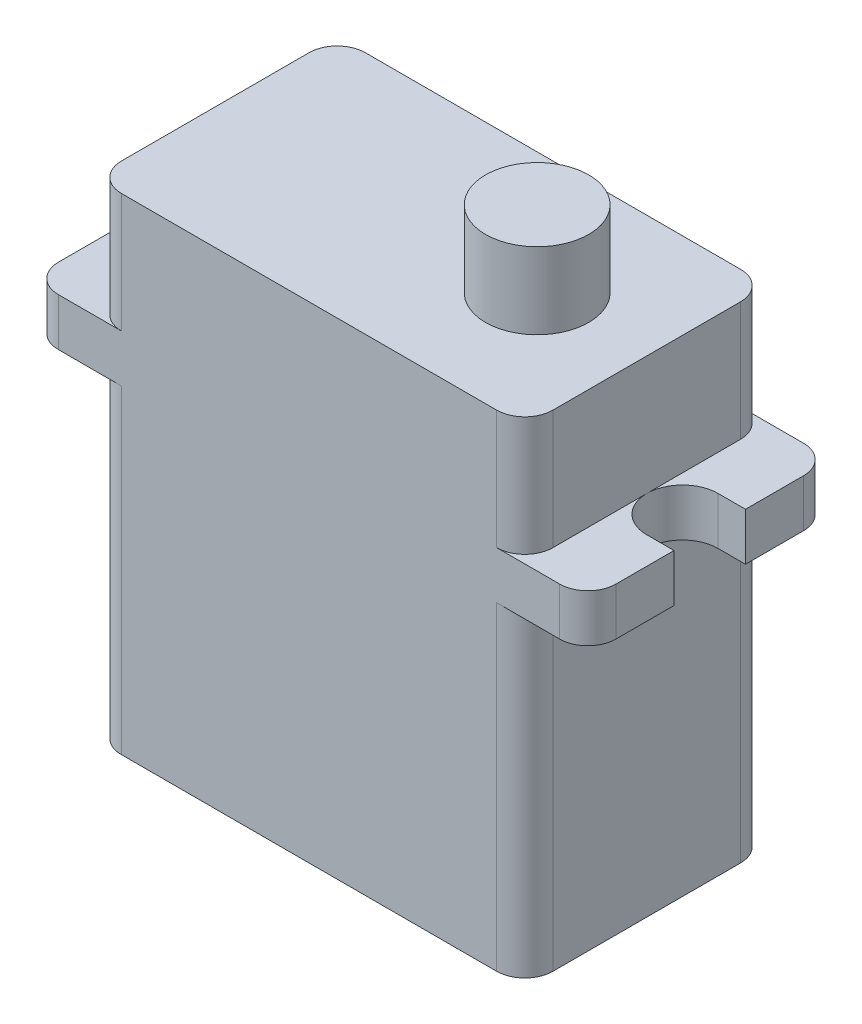
ISO-10303-21;
HEADER;
FILE_DESCRIPTION(('STEP AP214'),'2;1');
FILE_NAME('part.step','',(''),(''),'','','');
FILE_SCHEMA(('AUTOMOTIVE_DESIGN { 1 0 10303 214 1 1 1 1 }'));
ENDSEC;
DATA;
#1=APPLICATION_CONTEXT('core data for automotive mechanical design processes');
#2=APPLICATION_PROTOCOL_DEFINITION('international standard','automotive_design',2000,#1);
#3=PRODUCT_CONTEXT('',#1,'mechanical');
#4=PRODUCT('Part','Part','',(#3));
#5=PRODUCT_RELATED_PRODUCT_CATEGORY('part','',(#4));
#6=PRODUCT_DEFINITION_FORMATION('','',#4);
#7=PRODUCT_DEFINITION_CONTEXT('part definition',#1,'design');
#8=PRODUCT_DEFINITION('design','',#6,#7);
#9=PRODUCT_DEFINITION_SHAPE('','',#8);
#10=(LENGTH_UNIT() NAMED_UNIT(*) SI_UNIT(.MILLI.,.METRE.));
#11=(NAMED_UNIT(*) PLANE_ANGLE_UNIT() SI_UNIT($,.RADIAN.));
#12=(NAMED_UNIT(*) SI_UNIT($,.STERADIAN.) SOLID_ANGLE_UNIT());
#13=UNCERTAINTY_MEASURE_WITH_UNIT(LENGTH_MEASURE(1.E-05),#10,'distance_accuracy_value','');
#14=(GEOMETRIC_REPRESENTATION_CONTEXT(3) GLOBAL_UNCERTAINTY_ASSIGNED_CONTEXT((#13)) GLOBAL_UNIT_ASSIGNED_CONTEXT((#10,
#11,#12)) REPRESENTATION_CONTEXT('',''));
#15=CARTESIAN_POINT('',(0.,0.,0.));
#16=DIRECTION('',(0.,0.,1.));
#17=DIRECTION('',(1.,0.,0.));
#18=AXIS2_PLACEMENT_3D('',#15,#16,#17);
#19=CARTESIAN_POINT('',(0.,19.558,0.));
#20=DIRECTION('',(0.,1.,0.));
#21=DIRECTION('',(0.,0.,1.));
#22=AXIS2_PLACEMENT_3D('',#19,#20,#21);
#23=PLANE('',#22);
#24=CARTESIAN_POINT('',(-1.905,19.558,6.5));
#25=DIRECTION('',(0.,1.,0.));
#26=DIRECTION('',(0.,0.,1.));
#27=AXIS2_PLACEMENT_3D('',#24,#25,#26);
#28=CIRCLE('',#27,1.905);
#29=CARTESIAN_POINT('',(0.,19.558,6.5));
#30=VERTEX_POINT('',#29);
#31=CARTESIAN_POINT('',(-1.905,19.558,4.595));
#32=VERTEX_POINT('',#31);
#33=EDGE_CURVE('E376',#30,#32,#28,.T.);
#34=ORIENTED_EDGE('',*,*,#33,.F.);
#35=DIRECTION('',(0.,0.,-1.));
#36=VECTOR('',#35,1.);
#37=CARTESIAN_POINT('',(0.,19.558,11.5));
#38=LINE('',#37,#36);
#39=CARTESIAN_POINT('',(0.,19.558,1.50000000000001));
#40=VERTEX_POINT('',#39);
#41=EDGE_CURVE('E11',#30,#40,#38,.T.);
#42=ORIENTED_EDGE('',*,*,#41,.T.);
#43=CARTESIAN_POINT('',(1.5,19.558,1.5));
#44=DIRECTION('',(0.,-1.,0.));
#45=DIRECTION('',(0.,0.,-1.));
#46=AXIS2_PLACEMENT_3D('',#43,#44,#45);
#47=CIRCLE('',#46,1.5);
#48=CARTESIAN_POINT('',(1.5,19.558,0.));
#49=VERTEX_POINT('',#48);
#50=EDGE_CURVE('E334',#40,#49,#47,.T.);
#51=ORIENTED_EDGE('',*,*,#50,.T.);
#52=DIRECTION('',(-1.,0.,0.));
#53=VECTOR('',#52,1.);
#54=CARTESIAN_POINT('',(0.,19.558,0.));
#55=LINE('',#54,#53);
#56=CARTESIAN_POINT('',(-1.859,19.558,0.));
#57=VERTEX_POINT('',#56);
#58=EDGE_CURVE('E365',#49,#57,#55,.T.);
#59=ORIENTED_EDGE('',*,*,#58,.T.);
#60=CARTESIAN_POINT('',(-1.859,19.558,1.5));
#61=DIRECTION('',(0.,1.,0.));
#62=DIRECTION('',(0.,0.,1.));
#63=AXIS2_PLACEMENT_3D('',#60,#61,#62);
#64=CIRCLE('',#63,1.5);
#65=CARTESIAN_POINT('',(-3.359,19.558,1.5));
#66=VERTEX_POINT('',#65);
#67=EDGE_CURVE('E364',#66,#57,#64,.F.);
#68=ORIENTED_EDGE('',*,*,#67,.F.);
#69=DIRECTION('',(0.,0.,1.));
#70=VECTOR('',#69,1.);
#71=CARTESIAN_POINT('',(-3.359,19.558,0.));
#72=LINE('',#71,#70);
#73=CARTESIAN_POINT('',(-3.359,19.558,4.595));
#74=VERTEX_POINT('',#73);
#75=EDGE_CURVE('E369',#66,#74,#72,.T.);
#76=ORIENTED_EDGE('',*,*,#75,.T.);
#77=DIRECTION('',(-1.,0.,0.));
#78=VECTOR('',#77,1.);
#79=CARTESIAN_POINT('',(0.,19.558,4.595));
#80=LINE('',#79,#78);
#81=EDGE_CURVE('E372',#32,#74,#80,.T.);
#82=ORIENTED_EDGE('',*,*,#81,.F.);
#83=EDGE_LOOP('',(#34,#42,#51,#59,#68,#76,#82));
#84=FACE_BOUND('',#83,.T.);
#85=ADVANCED_FACE('F47',(#84),#23,.T.);
#86=CARTESIAN_POINT('',(24.859,19.558,0.));
#87=VERTEX_POINT('',#86);
#88=CARTESIAN_POINT('',(21.5,19.558,0.));
#89=VERTEX_POINT('',#88);
#90=EDGE_CURVE('E361',#87,#89,#55,.T.);
#91=ORIENTED_EDGE('',*,*,#90,.T.);
#92=CARTESIAN_POINT('',(21.5,19.558,1.5));
#93=DIRECTION('',(0.,-1.,0.));
#94=DIRECTION('',(0.,0.,-1.));
#95=AXIS2_PLACEMENT_3D('',#92,#93,#94);
#96=CIRCLE('',#95,1.5);
#97=CARTESIAN_POINT('',(23.,19.558,1.50000000000001));
#98=VERTEX_POINT('',#97);
#99=EDGE_CURVE('E331',#89,#98,#96,.T.);
#100=ORIENTED_EDGE('',*,*,#99,.T.);
#101=DIRECTION('',(0.,0.,1.));
#102=VECTOR('',#101,1.);
#103=CARTESIAN_POINT('',(23.,19.558,1.50000000000001));
#104=LINE('',#103,#102);
#105=CARTESIAN_POINT('',(23.,19.558,6.5));
#106=VERTEX_POINT('',#105);
#107=EDGE_CURVE('E328',#98,#106,#104,.T.);
#108=ORIENTED_EDGE('',*,*,#107,.T.);
#109=CARTESIAN_POINT('',(24.905,19.558,6.5));
#110=DIRECTION('',(0.,1.,0.));
#111=DIRECTION('',(0.,0.,1.));
#112=AXIS2_PLACEMENT_3D('',#109,#110,#111);
#113=CIRCLE('',#112,1.905);
#114=CARTESIAN_POINT('',(24.905,19.558,4.595));
#115=VERTEX_POINT('',#114);
#116=EDGE_CURVE('E407',#115,#106,#113,.T.);
#117=ORIENTED_EDGE('',*,*,#116,.F.);
#118=DIRECTION('',(1.,0.,0.));
#119=VECTOR('',#118,1.);
#120=CARTESIAN_POINT('',(0.,19.558,4.595));
#121=LINE('',#120,#119);
#122=CARTESIAN_POINT('',(26.359,19.558,4.595));
#123=VERTEX_POINT('',#122);
#124=EDGE_CURVE('E411',#115,#123,#121,.T.);
#125=ORIENTED_EDGE('',*,*,#124,.T.);
#126=DIRECTION('',(0.,0.,1.));
#127=VECTOR('',#126,1.);
#128=CARTESIAN_POINT('',(26.359,19.558,0.));
#129=LINE('',#128,#127);
#130=CARTESIAN_POINT('',(26.359,19.558,1.5));
#131=VERTEX_POINT('',#130);
#132=EDGE_CURVE('E414',#131,#123,#129,.T.);
#133=ORIENTED_EDGE('',*,*,#132,.F.);
#134=CARTESIAN_POINT('',(24.859,19.558,1.5));
#135=DIRECTION('',(0.,1.,0.));
#136=DIRECTION('',(0.,0.,1.));
#137=AXIS2_PLACEMENT_3D('',#134,#135,#136);
#138=CIRCLE('',#137,1.5);
#139=EDGE_CURVE('E418',#131,#87,#138,.T.);
#140=ORIENTED_EDGE('',*,*,#139,.T.);
#141=EDGE_LOOP('',(#91,#100,#108,#117,#125,#133,#140));
#142=FACE_BOUND('',#141,.T.);
#143=ADVANCED_FACE('F686',(#142),#23,.T.);
#144=CARTESIAN_POINT('',(24.905,19.558,8.405));
#145=VERTEX_POINT('',#144);
#146=EDGE_CURVE('E406',#106,#145,#113,.T.);
#147=ORIENTED_EDGE('',*,*,#146,.F.);
#148=CARTESIAN_POINT('',(23.,19.558,11.5));
#149=VERTEX_POINT('',#148);
#150=EDGE_CURVE('E57',#106,#149,#104,.T.);
#151=ORIENTED_EDGE('',*,*,#150,.T.);
#152=CARTESIAN_POINT('',(21.5,19.558,11.5));
#153=DIRECTION('',(0.,1.,0.));
#154=DIRECTION('',(0.,0.,1.));
#155=AXIS2_PLACEMENT_3D('',#152,#153,#154);
#156=CIRCLE('',#155,1.5);
#157=CARTESIAN_POINT('',(21.5,19.558,13.));
#158=VERTEX_POINT('',#157);
#159=EDGE_CURVE('E324',#158,#149,#156,.T.);
#160=ORIENTED_EDGE('',*,*,#159,.F.);
#161=DIRECTION('',(1.,0.,0.));
#162=VECTOR('',#161,1.);
#163=CARTESIAN_POINT('',(0.,19.558,13.));
#164=LINE('',#163,#162);
#165=CARTESIAN_POINT('',(24.859,19.558,13.));
#166=VERTEX_POINT('',#165);
#167=EDGE_CURVE('E391',#158,#166,#164,.T.);
#168=ORIENTED_EDGE('',*,*,#167,.T.);
#169=CARTESIAN_POINT('',(24.859,19.558,11.5));
#170=DIRECTION('',(0.,1.,0.));
#171=DIRECTION('',(0.,0.,1.));
#172=AXIS2_PLACEMENT_3D('',#169,#170,#171);
#173=CIRCLE('',#172,1.5);
#174=CARTESIAN_POINT('',(26.359,19.558,11.5));
#175=VERTEX_POINT('',#174);
#176=EDGE_CURVE('E395',#166,#175,#173,.T.);
#177=ORIENTED_EDGE('',*,*,#176,.T.);
#178=DIRECTION('',(0.,0.,1.));
#179=VECTOR('',#178,1.);
#180=CARTESIAN_POINT('',(26.359,19.558,0.));
#181=LINE('',#180,#179);
#182=CARTESIAN_POINT('',(26.359,19.558,8.405));
#183=VERTEX_POINT('',#182);
#184=EDGE_CURVE('E398',#183,#175,#181,.T.);
#185=ORIENTED_EDGE('',*,*,#184,.F.);
#186=DIRECTION('',(1.,0.,0.));
#187=VECTOR('',#186,1.);
#188=CARTESIAN_POINT('',(0.,19.558,8.405));
#189=LINE('',#188,#187);
#190=EDGE_CURVE('E402',#145,#183,#189,.T.);
#191=ORIENTED_EDGE('',*,*,#190,.F.);
#192=EDGE_LOOP('',(#147,#151,#160,#168,#177,#185,#191));
#193=FACE_BOUND('',#192,.T.);
#194=ADVANCED_FACE('F692',(#193),#23,.T.);
#195=CARTESIAN_POINT('',(1.5,17.018,1.5));
#196=DIRECTION('',(0.,-1.,0.));
#197=DIRECTION('',(0.,0.,-1.));
#198=AXIS2_PLACEMENT_3D('',#195,#196,#197);
#199=CYLINDRICAL_SURFACE('',#198,1.5);
#200=CARTESIAN_POINT('',(1.5,0.,1.5));
#201=DIRECTION('',(0.,-1.,0.));
#202=DIRECTION('',(0.,0.,-1.));
#203=AXIS2_PLACEMENT_3D('',#200,#201,#202);
#204=CIRCLE('',#203,1.5);
#205=CARTESIAN_POINT('',(0.,0.,1.50000000000001));
#206=VERTEX_POINT('',#205);
#207=CARTESIAN_POINT('',(1.50000000000001,0.,0.));
#208=VERTEX_POINT('',#207);
#209=EDGE_CURVE('E540',#206,#208,#204,.T.);
#210=ORIENTED_EDGE('',*,*,#209,.F.);
#211=DIRECTION('',(0.,-1.,0.));
#212=VECTOR('',#211,1.);
#213=CARTESIAN_POINT('',(0.,17.018,1.50000000000001));
#214=LINE('',#213,#212);
#215=CARTESIAN_POINT('',(0.,17.018,1.50000000000001));
#216=VERTEX_POINT('',#215);
#217=EDGE_CURVE('E597',#216,#206,#214,.T.);
#218=ORIENTED_EDGE('',*,*,#217,.F.);
#219=CARTESIAN_POINT('',(1.5,17.018,1.5));
#220=DIRECTION('',(0.,-1.,0.));
#221=DIRECTION('',(0.,0.,-1.));
#222=AXIS2_PLACEMENT_3D('',#219,#220,#221);
#223=CIRCLE('',#222,1.5);
#224=CARTESIAN_POINT('',(1.50000000000001,17.018,0.));
#225=VERTEX_POINT('',#224);
#226=EDGE_CURVE('E541',#216,#225,#223,.T.);
#227=ORIENTED_EDGE('',*,*,#226,.T.);
#228=DIRECTION('',(0.,-1.,0.));
#229=VECTOR('',#228,1.);
#230=CARTESIAN_POINT('',(1.50000000000001,17.018,0.));
#231=LINE('',#230,#229);
#232=EDGE_CURVE('E567',#225,#208,#231,.T.);
#233=ORIENTED_EDGE('',*,*,#232,.T.);
#234=EDGE_LOOP('',(#210,#218,#227,#233));
#235=FACE_BOUND('',#234,.T.);
#236=ADVANCED_FACE('F49',(#235),#199,.T.);
#237=CARTESIAN_POINT('',(0.,17.018,1.50000000000001));
#238=DIRECTION('',(1.,0.,0.));
#239=DIRECTION('',(0.,0.,-1.));
#240=AXIS2_PLACEMENT_3D('',#237,#238,#239);
#241=PLANE('',#240);
#242=DIRECTION('',(0.,0.,1.));
#243=VECTOR('',#242,1.);
#244=CARTESIAN_POINT('',(0.,0.,1.50000000000001));
#245=LINE('',#244,#243);
#246=CARTESIAN_POINT('',(0.,0.,11.5));
#247=VERTEX_POINT('',#246);
#248=EDGE_CURVE('E546',#206,#247,#245,.T.);
#249=ORIENTED_EDGE('',*,*,#248,.T.);
#250=DIRECTION('',(0.,-1.,0.));
#251=VECTOR('',#250,1.);
#252=CARTESIAN_POINT('',(0.,17.018,11.5));
#253=LINE('',#252,#251);
#254=CARTESIAN_POINT('',(0.,17.018,11.5));
#255=VERTEX_POINT('',#254);
#256=EDGE_CURVE('E600',#255,#247,#253,.T.);
#257=ORIENTED_EDGE('',*,*,#256,.F.);
#258=DIRECTION('',(0.,0.,1.));
#259=VECTOR('',#258,1.);
#260=CARTESIAN_POINT('',(0.,17.018,1.50000000000001));
#261=LINE('',#260,#259);
#262=CARTESIAN_POINT('',(0.,17.018,6.5));
#263=VERTEX_POINT('',#262);
#264=EDGE_CURVE('E562',#263,#255,#261,.T.);
#265=ORIENTED_EDGE('',*,*,#264,.F.);
#266=EDGE_CURVE('E563',#216,#263,#261,.T.);
#267=ORIENTED_EDGE('',*,*,#266,.F.);
#268=ORIENTED_EDGE('',*,*,#217,.T.);
#269=EDGE_LOOP('',(#249,#257,#265,#267,#268));
#270=FACE_BOUND('',#269,.T.);
#271=ADVANCED_FACE('F633',(#270),#241,.F.);
#272=CARTESIAN_POINT('',(1.5,17.018,11.5));
#273=DIRECTION('',(0.,-1.,0.));
#274=DIRECTION('',(0.,0.,-1.));
#275=AXIS2_PLACEMENT_3D('',#272,#273,#274);
#276=CYLINDRICAL_SURFACE('',#275,1.5);
#277=CARTESIAN_POINT('',(1.5,0.,11.5));
#278=DIRECTION('',(0.,-1.,0.));
#279=DIRECTION('',(0.,0.,-1.));
#280=AXIS2_PLACEMENT_3D('',#277,#278,#279);
#281=CIRCLE('',#280,1.5);
#282=CARTESIAN_POINT('',(1.5,0.,13.));
#283=VERTEX_POINT('',#282);
#284=EDGE_CURVE('E590',#283,#247,#281,.T.);
#285=ORIENTED_EDGE('',*,*,#284,.F.);
#286=DIRECTION('',(0.,-1.,0.));
#287=VECTOR('',#286,1.);
#288=CARTESIAN_POINT('',(1.5,17.018,13.));
#289=LINE('',#288,#287);
#290=CARTESIAN_POINT('',(1.5,17.018,13.));
#291=VERTEX_POINT('',#290);
#292=EDGE_CURVE('E603',#291,#283,#289,.T.);
#293=ORIENTED_EDGE('',*,*,#292,.F.);
#294=CARTESIAN_POINT('',(1.5,17.018,11.5));
#295=DIRECTION('',(0.,-1.,0.));
#296=DIRECTION('',(0.,0.,-1.));
#297=AXIS2_PLACEMENT_3D('',#294,#295,#296);
#298=CIRCLE('',#297,1.5);
#299=EDGE_CURVE('E558',#291,#255,#298,.T.);
#300=ORIENTED_EDGE('',*,*,#299,.T.);
#301=ORIENTED_EDGE('',*,*,#256,.T.);
#302=EDGE_LOOP('',(#285,#293,#300,#301));
#303=FACE_BOUND('',#302,.T.);
#304=ADVANCED_FACE('F1053',(#303),#276,.T.);
#305=CARTESIAN_POINT('',(1.5,17.018,13.));
#306=DIRECTION('',(0.,0.,-1.));
#307=DIRECTION('',(-1.,0.,0.));
#308=AXIS2_PLACEMENT_3D('',#305,#306,#307);
#309=PLANE('',#308);
#310=DIRECTION('',(1.,0.,0.));
#311=VECTOR('',#310,1.);
#312=CARTESIAN_POINT('',(1.5,0.,13.));
#313=LINE('',#312,#311);
#314=CARTESIAN_POINT('',(21.5,0.,13.));
#315=VERTEX_POINT('',#314);
#316=EDGE_CURVE('E587',#283,#315,#313,.T.);
#317=ORIENTED_EDGE('',*,*,#316,.T.);
#318=DIRECTION('',(0.,-1.,0.));
#319=VECTOR('',#318,1.);
#320=CARTESIAN_POINT('',(21.5,17.018,13.));
#321=LINE('',#320,#319);
#322=CARTESIAN_POINT('',(21.5,17.018,13.));
#323=VERTEX_POINT('',#322);
#324=EDGE_CURVE('E606',#323,#315,#321,.T.);
#325=ORIENTED_EDGE('',*,*,#324,.F.);
#326=DIRECTION('',(1.,0.,0.));
#327=VECTOR('',#326,1.);
#328=CARTESIAN_POINT('',(0.,17.018,13.));
#329=LINE('',#328,#327);
#330=CARTESIAN_POINT('',(24.859,17.018,13.));
#331=VERTEX_POINT('',#330);
#332=EDGE_CURVE('E454',#323,#331,#329,.T.);
#333=ORIENTED_EDGE('',*,*,#332,.T.);
#334=DIRECTION('',(0.,-1.,0.));
#335=VECTOR('',#334,1.);
#336=CARTESIAN_POINT('',(24.859,19.558,13.));
#337=LINE('',#336,#335);
#338=EDGE_CURVE('E509',#166,#331,#337,.T.);
#339=ORIENTED_EDGE('',*,*,#338,.F.);
#340=ORIENTED_EDGE('',*,*,#167,.F.);
#341=DIRECTION('',(0.,-1.,0.));
#342=VECTOR('',#341,1.);
#343=CARTESIAN_POINT('',(21.5,25.908,13.));
#344=LINE('',#343,#342);
#345=CARTESIAN_POINT('',(21.5,25.908,13.));
#346=VERTEX_POINT('',#345);
#347=EDGE_CURVE('E290',#346,#158,#344,.T.);
#348=ORIENTED_EDGE('',*,*,#347,.F.);
#349=DIRECTION('',(-1.,0.,0.));
#350=VECTOR('',#349,1.);
#351=CARTESIAN_POINT('',(21.5,25.908,13.));
#352=LINE('',#351,#350);
#353=CARTESIAN_POINT('',(1.50000000000001,25.908,13.));
#354=VERTEX_POINT('',#353);
#355=EDGE_CURVE('E276',#346,#354,#352,.T.);
#356=ORIENTED_EDGE('',*,*,#355,.T.);
#357=DIRECTION('',(0.,-1.,0.));
#358=VECTOR('',#357,1.);
#359=CARTESIAN_POINT('',(1.50000000000001,25.908,13.));
#360=LINE('',#359,#358);
#361=CARTESIAN_POINT('',(1.5,19.558,13.));
#362=VERTEX_POINT('',#361);
#363=EDGE_CURVE('E284',#354,#362,#360,.T.);
#364=ORIENTED_EDGE('',*,*,#363,.T.);
#365=CARTESIAN_POINT('',(-1.859,19.558,13.));
#366=VERTEX_POINT('',#365);
#367=EDGE_CURVE('E392',#366,#362,#164,.T.);
#368=ORIENTED_EDGE('',*,*,#367,.F.);
#369=DIRECTION('',(0.,-1.,0.));
#370=VECTOR('',#369,1.);
#371=CARTESIAN_POINT('',(-1.859,19.558,13.));
#372=LINE('',#371,#370);
#373=CARTESIAN_POINT('',(-1.859,17.018,13.));
#374=VERTEX_POINT('',#373);
#375=EDGE_CURVE('E513',#366,#374,#372,.T.);
#376=ORIENTED_EDGE('',*,*,#375,.T.);
#377=EDGE_CURVE('E455',#374,#291,#329,.T.);
#378=ORIENTED_EDGE('',*,*,#377,.T.);
#379=ORIENTED_EDGE('',*,*,#292,.T.);
#380=EDGE_LOOP('',(#317,#325,#333,#339,#340,#348,#356,#364,#368,#376,#378,#379));
#381=FACE_BOUND('',#380,.T.);
#382=ADVANCED_FACE('F292',(#381),#309,.F.);
#383=CARTESIAN_POINT('',(21.5,17.018,11.5));
#384=DIRECTION('',(0.,-1.,0.));
#385=DIRECTION('',(0.,0.,-1.));
#386=AXIS2_PLACEMENT_3D('',#383,#384,#385);
#387=CYLINDRICAL_SURFACE('',#386,1.5);
#388=CARTESIAN_POINT('',(21.5,0.,11.5));
#389=DIRECTION('',(0.,1.,0.));
#390=DIRECTION('',(0.,0.,1.));
#391=AXIS2_PLACEMENT_3D('',#388,#389,#390);
#392=CIRCLE('',#391,1.5);
#393=CARTESIAN_POINT('',(23.,0.,11.5));
#394=VERTEX_POINT('',#393);
#395=EDGE_CURVE('E583',#315,#394,#392,.T.);
#396=ORIENTED_EDGE('',*,*,#395,.T.);
#397=DIRECTION('',(0.,-1.,0.));
#398=VECTOR('',#397,1.);
#399=CARTESIAN_POINT('',(23.,17.018,11.5));
#400=LINE('',#399,#398);
#401=CARTESIAN_POINT('',(23.,17.018,11.5));
#402=VERTEX_POINT('',#401);
#403=EDGE_CURVE('E610',#402,#394,#400,.T.);
#404=ORIENTED_EDGE('',*,*,#403,.F.);
#405=CARTESIAN_POINT('',(21.5,17.018,11.5));
#406=DIRECTION('',(0.,1.,0.));
#407=DIRECTION('',(0.,0.,1.));
#408=AXIS2_PLACEMENT_3D('',#405,#406,#407);
#409=CIRCLE('',#408,1.5);
#410=EDGE_CURVE('E554',#323,#402,#409,.T.);
#411=ORIENTED_EDGE('',*,*,#410,.F.);
#412=ORIENTED_EDGE('',*,*,#324,.T.);
#413=EDGE_LOOP('',(#396,#404,#411,#412));
#414=FACE_BOUND('',#413,.T.);
#415=ADVANCED_FACE('F1037',(#414),#387,.T.);
#416=CARTESIAN_POINT('',(23.,17.018,1.50000000000001));
#417=DIRECTION('',(1.,0.,0.));
#418=DIRECTION('',(0.,0.,-1.));
#419=AXIS2_PLACEMENT_3D('',#416,#417,#418);
#420=PLANE('',#419);
#421=DIRECTION('',(0.,0.,1.));
#422=VECTOR('',#421,1.);
#423=CARTESIAN_POINT('',(23.,0.,1.50000000000001));
#424=LINE('',#423,#422);
#425=CARTESIAN_POINT('',(23.,0.,1.50000000000001));
#426=VERTEX_POINT('',#425);
#427=EDGE_CURVE('E579',#426,#394,#424,.T.);
#428=ORIENTED_EDGE('',*,*,#427,.F.);
#429=DIRECTION('',(0.,-1.,0.));
#430=VECTOR('',#429,1.);
#431=CARTESIAN_POINT('',(23.,17.018,1.50000000000001));
#432=LINE('',#431,#430);
#433=CARTESIAN_POINT('',(23.,17.018,1.50000000000001));
#434=VERTEX_POINT('',#433);
#435=EDGE_CURVE('E613',#434,#426,#432,.T.);
#436=ORIENTED_EDGE('',*,*,#435,.F.);
#437=DIRECTION('',(0.,0.,1.));
#438=VECTOR('',#437,1.);
#439=CARTESIAN_POINT('',(23.,17.018,1.50000000000001));
#440=LINE('',#439,#438);
#441=CARTESIAN_POINT('',(23.,17.018,6.5));
#442=VERTEX_POINT('',#441);
#443=EDGE_CURVE('E551',#434,#442,#440,.T.);
#444=ORIENTED_EDGE('',*,*,#443,.T.);
#445=EDGE_CURVE('E550',#442,#402,#440,.T.);
#446=ORIENTED_EDGE('',*,*,#445,.T.);
#447=ORIENTED_EDGE('',*,*,#403,.T.);
#448=EDGE_LOOP('',(#428,#436,#444,#446,#447));
#449=FACE_BOUND('',#448,.T.);
#450=ADVANCED_FACE('F1028',(#449),#420,.T.);
#451=CARTESIAN_POINT('',(21.5,17.018,1.5));
#452=DIRECTION('',(0.,-1.,0.));
#453=DIRECTION('',(0.,0.,-1.));
#454=AXIS2_PLACEMENT_3D('',#451,#452,#453);
#455=CYLINDRICAL_SURFACE('',#454,1.5);
#456=CARTESIAN_POINT('',(21.5,0.,1.5));
#457=DIRECTION('',(0.,1.,0.));
#458=DIRECTION('',(0.,0.,1.));
#459=AXIS2_PLACEMENT_3D('',#456,#457,#458);
#460=CIRCLE('',#459,1.5);
#461=CARTESIAN_POINT('',(21.5,0.,0.));
#462=VERTEX_POINT('',#461);
#463=EDGE_CURVE('E575',#426,#462,#460,.T.);
#464=ORIENTED_EDGE('',*,*,#463,.T.);
#465=DIRECTION('',(0.,-1.,0.));
#466=VECTOR('',#465,1.);
#467=CARTESIAN_POINT('',(21.5,17.018,0.));
#468=LINE('',#467,#466);
#469=CARTESIAN_POINT('',(21.5,17.018,0.));
#470=VERTEX_POINT('',#469);
#471=EDGE_CURVE('E616',#470,#462,#468,.T.);
#472=ORIENTED_EDGE('',*,*,#471,.F.);
#473=CARTESIAN_POINT('',(21.5,17.018,1.5));
#474=DIRECTION('',(0.,1.,0.));
#475=DIRECTION('',(0.,0.,1.));
#476=AXIS2_PLACEMENT_3D('',#473,#474,#475);
#477=CIRCLE('',#476,1.5);
#478=EDGE_CURVE('E545',#434,#470,#477,.T.);
#479=ORIENTED_EDGE('',*,*,#478,.F.);
#480=ORIENTED_EDGE('',*,*,#435,.T.);
#481=EDGE_LOOP('',(#464,#472,#479,#480));
#482=FACE_BOUND('',#481,.T.);
#483=ADVANCED_FACE('F1020',(#482),#455,.T.);
#484=CARTESIAN_POINT('',(1.50000000000001,17.018,0.));
#485=DIRECTION('',(0.,0.,-1.));
#486=DIRECTION('',(-1.,0.,0.));
#487=AXIS2_PLACEMENT_3D('',#484,#485,#486);
#488=PLANE('',#487);
#489=DIRECTION('',(1.,0.,0.));
#490=VECTOR('',#489,1.);
#491=CARTESIAN_POINT('',(1.50000000000001,0.,0.));
#492=LINE('',#491,#490);
#493=EDGE_CURVE('E571',#208,#462,#492,.T.);
#494=ORIENTED_EDGE('',*,*,#493,.F.);
#495=ORIENTED_EDGE('',*,*,#232,.F.);
#496=DIRECTION('',(-1.,0.,0.));
#497=VECTOR('',#496,1.);
#498=CARTESIAN_POINT('',(0.,17.018,0.));
#499=LINE('',#498,#497);
#500=CARTESIAN_POINT('',(-1.859,17.018,0.));
#501=VERTEX_POINT('',#500);
#502=EDGE_CURVE('E289',#225,#501,#499,.T.);
#503=ORIENTED_EDGE('',*,*,#502,.T.);
#504=DIRECTION('',(0.,-1.,0.));
#505=VECTOR('',#504,1.);
#506=CARTESIAN_POINT('',(-1.859,19.558,0.));
#507=LINE('',#506,#505);
#508=EDGE_CURVE('E536',#57,#501,#507,.T.);
#509=ORIENTED_EDGE('',*,*,#508,.F.);
#510=ORIENTED_EDGE('',*,*,#58,.F.);
#511=DIRECTION('',(0.,-1.,0.));
#512=VECTOR('',#511,1.);
#513=CARTESIAN_POINT('',(1.5,25.908,0.));
#514=LINE('',#513,#512);
#515=CARTESIAN_POINT('',(1.5,25.908,0.));
#516=VERTEX_POINT('',#515);
#517=EDGE_CURVE('E343',#516,#49,#514,.T.);
#518=ORIENTED_EDGE('',*,*,#517,.F.);
#519=DIRECTION('',(1.,0.,0.));
#520=VECTOR('',#519,1.);
#521=CARTESIAN_POINT('',(1.50000000000001,25.908,0.));
#522=LINE('',#521,#520);
#523=CARTESIAN_POINT('',(21.5,25.908,0.));
#524=VERTEX_POINT('',#523);
#525=EDGE_CURVE('E311',#516,#524,#522,.T.);
#526=ORIENTED_EDGE('',*,*,#525,.T.);
#527=DIRECTION('',(0.,-1.,0.));
#528=VECTOR('',#527,1.);
#529=CARTESIAN_POINT('',(21.5,25.908,0.));
#530=LINE('',#529,#528);
#531=EDGE_CURVE('E347',#524,#89,#530,.T.);
#532=ORIENTED_EDGE('',*,*,#531,.T.);
#533=ORIENTED_EDGE('',*,*,#90,.F.);
#534=DIRECTION('',(0.,-1.,0.));
#535=VECTOR('',#534,1.);
#536=CARTESIAN_POINT('',(24.859,19.558,0.));
#537=LINE('',#536,#535);
#538=CARTESIAN_POINT('',(24.859,17.018,0.));
#539=VERTEX_POINT('',#538);
#540=EDGE_CURVE('E421',#87,#539,#537,.T.);
#541=ORIENTED_EDGE('',*,*,#540,.T.);
#542=EDGE_CURVE('E422',#539,#470,#499,.T.);
#543=ORIENTED_EDGE('',*,*,#542,.T.);
#544=ORIENTED_EDGE('',*,*,#471,.T.);
#545=EDGE_LOOP('',(#494,#495,#503,#509,#510,#518,#526,#532,#533,#541,#543,#544));
#546=FACE_BOUND('',#545,.T.);
#547=ADVANCED_FACE('F625',(#546),#488,.T.);
#548=CARTESIAN_POINT('',(1.5,0.,1.5));
#549=DIRECTION('',(0.,-1.,0.));
#550=DIRECTION('',(0.,0.,-1.));
#551=AXIS2_PLACEMENT_3D('',#548,#549,#550);
#552=PLANE('',#551);
#553=ORIENTED_EDGE('',*,*,#209,.T.);
#554=ORIENTED_EDGE('',*,*,#493,.T.);
#555=ORIENTED_EDGE('',*,*,#463,.F.);
#556=ORIENTED_EDGE('',*,*,#427,.T.);
#557=ORIENTED_EDGE('',*,*,#395,.F.);
#558=ORIENTED_EDGE('',*,*,#316,.F.);
#559=ORIENTED_EDGE('',*,*,#284,.T.);
#560=ORIENTED_EDGE('',*,*,#248,.F.);
#561=EDGE_LOOP('',(#553,#554,#555,#556,#557,#558,#559,#560));
#562=FACE_BOUND('',#561,.T.);
#563=ADVANCED_FACE('F629',(#562),#552,.T.);
#564=CARTESIAN_POINT('',(0.,17.018,0.));
#565=DIRECTION('',(0.,1.,0.));
#566=DIRECTION('',(0.,0.,1.));
#567=AXIS2_PLACEMENT_3D('',#564,#565,#566);
#568=PLANE('',#567);
#569=ORIENTED_EDGE('',*,*,#226,.F.);
#570=ORIENTED_EDGE('',*,*,#266,.T.);
#571=CARTESIAN_POINT('',(-1.905,17.018,6.5));
#572=DIRECTION('',(0.,1.,0.));
#573=DIRECTION('',(0.,0.,1.));
#574=AXIS2_PLACEMENT_3D('',#571,#572,#573);
#575=CIRCLE('',#574,1.905);
#576=CARTESIAN_POINT('',(-1.905,17.018,4.595));
#577=VERTEX_POINT('',#576);
#578=EDGE_CURVE('E438',#263,#577,#575,.T.);
#579=ORIENTED_EDGE('',*,*,#578,.T.);
#580=DIRECTION('',(-1.,0.,0.));
#581=VECTOR('',#580,1.);
#582=CARTESIAN_POINT('',(0.,17.018,4.595));
#583=LINE('',#582,#581);
#584=CARTESIAN_POINT('',(-3.359,17.018,4.595));
#585=VERTEX_POINT('',#584);
#586=EDGE_CURVE('E434',#577,#585,#583,.T.);
#587=ORIENTED_EDGE('',*,*,#586,.T.);
#588=DIRECTION('',(0.,0.,1.));
#589=VECTOR('',#588,1.);
#590=CARTESIAN_POINT('',(-3.359,17.018,0.));
#591=LINE('',#590,#589);
#592=CARTESIAN_POINT('',(-3.359,17.018,1.5));
#593=VERTEX_POINT('',#592);
#594=EDGE_CURVE('E430',#593,#585,#591,.T.);
#595=ORIENTED_EDGE('',*,*,#594,.F.);
#596=CARTESIAN_POINT('',(-1.859,17.018,1.5));
#597=DIRECTION('',(0.,1.,0.));
#598=DIRECTION('',(0.,0.,1.));
#599=AXIS2_PLACEMENT_3D('',#596,#597,#598);
#600=CIRCLE('',#599,1.5);
#601=EDGE_CURVE('E426',#593,#501,#600,.F.);
#602=ORIENTED_EDGE('',*,*,#601,.T.);
#603=ORIENTED_EDGE('',*,*,#502,.F.);
#604=EDGE_LOOP('',(#569,#570,#579,#587,#595,#602,#603));
#605=FACE_BOUND('',#604,.T.);
#606=ADVANCED_FACE('F638',(#605),#568,.F.);
#607=CARTESIAN_POINT('',(-1.905,17.018,8.405));
#608=VERTEX_POINT('',#607);
#609=EDGE_CURVE('E439',#608,#263,#575,.T.);
#610=ORIENTED_EDGE('',*,*,#609,.T.);
#611=ORIENTED_EDGE('',*,*,#264,.T.);
#612=ORIENTED_EDGE('',*,*,#299,.F.);
#613=ORIENTED_EDGE('',*,*,#377,.F.);
#614=CARTESIAN_POINT('',(-1.859,17.018,11.5));
#615=DIRECTION('',(0.,1.,0.));
#616=DIRECTION('',(0.,0.,1.));
#617=AXIS2_PLACEMENT_3D('',#614,#615,#616);
#618=CIRCLE('',#617,1.5);
#619=CARTESIAN_POINT('',(-3.359,17.018,11.5));
#620=VERTEX_POINT('',#619);
#621=EDGE_CURVE('E450',#374,#620,#618,.F.);
#622=ORIENTED_EDGE('',*,*,#621,.T.);
#623=DIRECTION('',(0.,0.,1.));
#624=VECTOR('',#623,1.);
#625=CARTESIAN_POINT('',(-3.359,17.018,0.));
#626=LINE('',#625,#624);
#627=CARTESIAN_POINT('',(-3.359,17.018,8.405));
#628=VERTEX_POINT('',#627);
#629=EDGE_CURVE('E446',#628,#620,#626,.T.);
#630=ORIENTED_EDGE('',*,*,#629,.F.);
#631=DIRECTION('',(-1.,0.,0.));
#632=VECTOR('',#631,1.);
#633=CARTESIAN_POINT('',(0.,17.018,8.405));
#634=LINE('',#633,#632);
#635=EDGE_CURVE('E443',#608,#628,#634,.T.);
#636=ORIENTED_EDGE('',*,*,#635,.F.);
#637=EDGE_LOOP('',(#610,#611,#612,#613,#622,#630,#636));
#638=FACE_BOUND('',#637,.T.);
#639=ADVANCED_FACE('F654',(#638),#568,.F.);
#640=ORIENTED_EDGE('',*,*,#443,.F.);
#641=ORIENTED_EDGE('',*,*,#478,.T.);
#642=ORIENTED_EDGE('',*,*,#542,.F.);
#643=CARTESIAN_POINT('',(24.859,17.018,1.5));
#644=DIRECTION('',(0.,1.,0.));
#645=DIRECTION('',(0.,0.,1.));
#646=AXIS2_PLACEMENT_3D('',#643,#644,#645);
#647=CIRCLE('',#646,1.5);
#648=CARTESIAN_POINT('',(26.359,17.018,1.5));
#649=VERTEX_POINT('',#648);
#650=EDGE_CURVE('E484',#649,#539,#647,.T.);
#651=ORIENTED_EDGE('',*,*,#650,.F.);
#652=DIRECTION('',(0.,0.,1.));
#653=VECTOR('',#652,1.);
#654=CARTESIAN_POINT('',(26.359,17.018,0.));
#655=LINE('',#654,#653);
#656=CARTESIAN_POINT('',(26.359,17.018,4.595));
#657=VERTEX_POINT('',#656);
#658=EDGE_CURVE('E480',#649,#657,#655,.T.);
#659=ORIENTED_EDGE('',*,*,#658,.T.);
#660=DIRECTION('',(1.,0.,0.));
#661=VECTOR('',#660,1.);
#662=CARTESIAN_POINT('',(0.,17.018,4.595));
#663=LINE('',#662,#661);
#664=CARTESIAN_POINT('',(24.905,17.018,4.595));
#665=VERTEX_POINT('',#664);
#666=EDGE_CURVE('E476',#665,#657,#663,.T.);
#667=ORIENTED_EDGE('',*,*,#666,.F.);
#668=CARTESIAN_POINT('',(24.905,17.018,6.5));
#669=DIRECTION('',(0.,1.,0.));
#670=DIRECTION('',(0.,0.,1.));
#671=AXIS2_PLACEMENT_3D('',#668,#669,#670);
#672=CIRCLE('',#671,1.905);
#673=EDGE_CURVE('E472',#665,#442,#672,.T.);
#674=ORIENTED_EDGE('',*,*,#673,.T.);
#675=EDGE_LOOP('',(#640,#641,#642,#651,#659,#667,#674));
#676=FACE_BOUND('',#675,.T.);
#677=ADVANCED_FACE('F704',(#676),#568,.F.);
#678=CARTESIAN_POINT('',(-1.859,19.558,1.5));
#679=DIRECTION('',(0.,-1.,0.));
#680=DIRECTION('',(0.,0.,-1.));
#681=AXIS2_PLACEMENT_3D('',#678,#679,#680);
#682=CYLINDRICAL_SURFACE('',#681,1.5);
#683=ORIENTED_EDGE('',*,*,#601,.F.);
#684=DIRECTION('',(0.,-1.,0.));
#685=VECTOR('',#684,1.);
#686=CARTESIAN_POINT('',(-3.359,19.558,1.5));
#687=LINE('',#686,#685);
#688=EDGE_CURVE('E533',#66,#593,#687,.T.);
#689=ORIENTED_EDGE('',*,*,#688,.F.);
#690=ORIENTED_EDGE('',*,*,#67,.T.);
#691=ORIENTED_EDGE('',*,*,#508,.T.);
#692=EDGE_LOOP('',(#683,#689,#690,#691));
#693=FACE_BOUND('',#692,.T.);
#694=ADVANCED_FACE('F673',(#693),#682,.T.);
#695=CARTESIAN_POINT('',(-3.359,19.558,0.));
#696=DIRECTION('',(1.,0.,0.));
#697=DIRECTION('',(0.,0.,-1.));
#698=AXIS2_PLACEMENT_3D('',#695,#696,#697);
#699=PLANE('',#698);
#700=ORIENTED_EDGE('',*,*,#594,.T.);
#701=DIRECTION('',(0.,-1.,0.));
#702=VECTOR('',#701,1.);
#703=CARTESIAN_POINT('',(-3.359,19.558,4.595));
#704=LINE('',#703,#702);
#705=EDGE_CURVE('E530',#74,#585,#704,.T.);
#706=ORIENTED_EDGE('',*,*,#705,.F.);
#707=ORIENTED_EDGE('',*,*,#75,.F.);
#708=ORIENTED_EDGE('',*,*,#688,.T.);
#709=EDGE_LOOP('',(#700,#706,#707,#708));
#710=FACE_BOUND('',#709,.T.);
#711=ADVANCED_FACE('F670',(#710),#699,.F.);
#712=CARTESIAN_POINT('',(0.,19.558,4.595));
#713=DIRECTION('',(0.,0.,1.));
#714=DIRECTION('',(1.,0.,0.));
#715=AXIS2_PLACEMENT_3D('',#712,#713,#714);
#716=PLANE('',#715);
#717=ORIENTED_EDGE('',*,*,#586,.F.);
#718=DIRECTION('',(0.,-1.,0.));
#719=VECTOR('',#718,1.);
#720=CARTESIAN_POINT('',(-1.905,19.558,4.595));
#721=LINE('',#720,#719);
#722=EDGE_CURVE('E526',#32,#577,#721,.T.);
#723=ORIENTED_EDGE('',*,*,#722,.F.);
#724=ORIENTED_EDGE('',*,*,#81,.T.);
#725=ORIENTED_EDGE('',*,*,#705,.T.);
#726=EDGE_LOOP('',(#717,#723,#724,#725));
#727=FACE_BOUND('',#726,.T.);
#728=ADVANCED_FACE('F665',(#727),#716,.T.);
#729=CARTESIAN_POINT('',(-1.905,19.558,6.5));
#730=DIRECTION('',(0.,-1.,0.));
#731=DIRECTION('',(0.,0.,-1.));
#732=AXIS2_PLACEMENT_3D('',#729,#730,#731);
#733=CYLINDRICAL_SURFACE('',#732,1.905);
#734=ORIENTED_EDGE('',*,*,#609,.F.);
#735=DIRECTION('',(0.,-1.,0.));
#736=VECTOR('',#735,1.);
#737=CARTESIAN_POINT('',(-1.905,19.558,8.405));
#738=LINE('',#737,#736);
#739=CARTESIAN_POINT('',(-1.905,19.558,8.405));
#740=VERTEX_POINT('',#739);
#741=EDGE_CURVE('E523',#740,#608,#738,.T.);
#742=ORIENTED_EDGE('',*,*,#741,.F.);
#743=EDGE_CURVE('E377',#740,#30,#28,.T.);
#744=ORIENTED_EDGE('',*,*,#743,.T.);
#745=ORIENTED_EDGE('',*,*,#33,.T.);
#746=ORIENTED_EDGE('',*,*,#722,.T.);
#747=ORIENTED_EDGE('',*,*,#578,.F.);
#748=EDGE_LOOP('',(#734,#742,#744,#745,#746,#747));
#749=FACE_BOUND('',#748,.T.);
#750=ADVANCED_FACE('F660',(#749),#733,.F.);
#751=CARTESIAN_POINT('',(0.,19.558,8.405));
#752=DIRECTION('',(0.,0.,1.));
#753=DIRECTION('',(1.,0.,0.));
#754=AXIS2_PLACEMENT_3D('',#751,#752,#753);
#755=PLANE('',#754);
#756=ORIENTED_EDGE('',*,*,#635,.T.);
#757=DIRECTION('',(0.,-1.,0.));
#758=VECTOR('',#757,1.);
#759=CARTESIAN_POINT('',(-3.359,19.558,8.405));
#760=LINE('',#759,#758);
#761=CARTESIAN_POINT('',(-3.359,19.558,8.405));
#762=VERTEX_POINT('',#761);
#763=EDGE_CURVE('E519',#762,#628,#760,.T.);
#764=ORIENTED_EDGE('',*,*,#763,.F.);
#765=DIRECTION('',(-1.,0.,0.));
#766=VECTOR('',#765,1.);
#767=CARTESIAN_POINT('',(0.,19.558,8.405));
#768=LINE('',#767,#766);
#769=EDGE_CURVE('E381',#740,#762,#768,.T.);
#770=ORIENTED_EDGE('',*,*,#769,.F.);
#771=ORIENTED_EDGE('',*,*,#741,.T.);
#772=EDGE_LOOP('',(#756,#764,#770,#771));
#773=FACE_BOUND('',#772,.T.);
#774=ADVANCED_FACE('F942',(#773),#755,.F.);
#775=CARTESIAN_POINT('',(-3.359,19.558,0.));
#776=DIRECTION('',(1.,0.,0.));
#777=DIRECTION('',(0.,0.,-1.));
#778=AXIS2_PLACEMENT_3D('',#775,#776,#777);
#779=PLANE('',#778);
#780=ORIENTED_EDGE('',*,*,#629,.T.);
#781=DIRECTION('',(0.,-1.,0.));
#782=VECTOR('',#781,1.);
#783=CARTESIAN_POINT('',(-3.359,19.558,11.5));
#784=LINE('',#783,#782);
#785=CARTESIAN_POINT('',(-3.359,19.558,11.5));
#786=VERTEX_POINT('',#785);
#787=EDGE_CURVE('E516',#786,#620,#784,.T.);
#788=ORIENTED_EDGE('',*,*,#787,.F.);
#789=DIRECTION('',(0.,0.,1.));
#790=VECTOR('',#789,1.);
#791=CARTESIAN_POINT('',(-3.359,19.558,0.));
#792=LINE('',#791,#790);
#793=EDGE_CURVE('E384',#762,#786,#792,.T.);
#794=ORIENTED_EDGE('',*,*,#793,.F.);
#795=ORIENTED_EDGE('',*,*,#763,.T.);
#796=EDGE_LOOP('',(#780,#788,#794,#795));
#797=FACE_BOUND('',#796,.T.);
#798=ADVANCED_FACE('F933',(#797),#779,.F.);
#799=CARTESIAN_POINT('',(-1.859,19.558,11.5));
#800=DIRECTION('',(0.,-1.,0.));
#801=DIRECTION('',(0.,0.,-1.));
#802=AXIS2_PLACEMENT_3D('',#799,#800,#801);
#803=CYLINDRICAL_SURFACE('',#802,1.5);
#804=ORIENTED_EDGE('',*,*,#621,.F.);
#805=ORIENTED_EDGE('',*,*,#375,.F.);
#806=CARTESIAN_POINT('',(-1.859,19.558,11.5));
#807=DIRECTION('',(0.,1.,0.));
#808=DIRECTION('',(0.,0.,1.));
#809=AXIS2_PLACEMENT_3D('',#806,#807,#808);
#810=CIRCLE('',#809,1.5);
#811=EDGE_CURVE('E387',#366,#786,#810,.F.);
#812=ORIENTED_EDGE('',*,*,#811,.T.);
#813=ORIENTED_EDGE('',*,*,#787,.T.);
#814=EDGE_LOOP('',(#804,#805,#812,#813));
#815=FACE_BOUND('',#814,.T.);
#816=ADVANCED_FACE('F925',(#815),#803,.T.);
#817=CARTESIAN_POINT('',(24.859,19.558,11.5));
#818=DIRECTION('',(0.,-1.,0.));
#819=DIRECTION('',(0.,0.,-1.));
#820=AXIS2_PLACEMENT_3D('',#817,#818,#819);
#821=CYLINDRICAL_SURFACE('',#820,1.5);
#822=CARTESIAN_POINT('',(24.859,17.018,11.5));
#823=DIRECTION('',(0.,1.,0.));
#824=DIRECTION('',(0.,0.,1.));
#825=AXIS2_PLACEMENT_3D('',#822,#823,#824);
#826=CIRCLE('',#825,1.5);
#827=CARTESIAN_POINT('',(26.359,17.018,11.5));
#828=VERTEX_POINT('',#827);
#829=EDGE_CURVE('E459',#331,#828,#826,.T.);
#830=ORIENTED_EDGE('',*,*,#829,.T.);
#831=DIRECTION('',(0.,-1.,0.));
#832=VECTOR('',#831,1.);
#833=CARTESIAN_POINT('',(26.359,19.558,11.5));
#834=LINE('',#833,#832);
#835=EDGE_CURVE('E506',#175,#828,#834,.T.);
#836=ORIENTED_EDGE('',*,*,#835,.F.);
#837=ORIENTED_EDGE('',*,*,#176,.F.);
#838=ORIENTED_EDGE('',*,*,#338,.T.);
#839=EDGE_LOOP('',(#830,#836,#837,#838));
#840=FACE_BOUND('',#839,.T.);
#841=ADVANCED_FACE('F739',(#840),#821,.T.);
#842=CARTESIAN_POINT('',(26.359,19.558,0.));
#843=DIRECTION('',(1.,0.,0.));
#844=DIRECTION('',(0.,0.,-1.));
#845=AXIS2_PLACEMENT_3D('',#842,#843,#844);
#846=PLANE('',#845);
#847=DIRECTION('',(0.,0.,1.));
#848=VECTOR('',#847,1.);
#849=CARTESIAN_POINT('',(26.359,17.018,0.));
#850=LINE('',#849,#848);
#851=CARTESIAN_POINT('',(26.359,17.018,8.405));
#852=VERTEX_POINT('',#851);
#853=EDGE_CURVE('E463',#852,#828,#850,.T.);
#854=ORIENTED_EDGE('',*,*,#853,.F.);
#855=DIRECTION('',(0.,-1.,0.));
#856=VECTOR('',#855,1.);
#857=CARTESIAN_POINT('',(26.359,19.558,8.405));
#858=LINE('',#857,#856);
#859=EDGE_CURVE('E503',#183,#852,#858,.T.);
#860=ORIENTED_EDGE('',*,*,#859,.F.);
#861=ORIENTED_EDGE('',*,*,#184,.T.);
#862=ORIENTED_EDGE('',*,*,#835,.T.);
#863=EDGE_LOOP('',(#854,#860,#861,#862));
#864=FACE_BOUND('',#863,.T.);
#865=ADVANCED_FACE('F910',(#864),#846,.T.);
#866=CARTESIAN_POINT('',(0.,19.558,8.405));
#867=DIRECTION('',(0.,0.,-1.));
#868=DIRECTION('',(-1.,0.,0.));
#869=AXIS2_PLACEMENT_3D('',#866,#867,#868);
#870=PLANE('',#869);
#871=DIRECTION('',(1.,0.,0.));
#872=VECTOR('',#871,1.);
#873=CARTESIAN_POINT('',(0.,17.018,8.405));
#874=LINE('',#873,#872);
#875=CARTESIAN_POINT('',(24.905,17.018,8.405));
#876=VERTEX_POINT('',#875);
#877=EDGE_CURVE('E467',#876,#852,#874,.T.);
#878=ORIENTED_EDGE('',*,*,#877,.F.);
#879=DIRECTION('',(0.,-1.,0.));
#880=VECTOR('',#879,1.);
#881=CARTESIAN_POINT('',(24.905,19.558,8.405));
#882=LINE('',#881,#880);
#883=EDGE_CURVE('E499',#145,#876,#882,.T.);
#884=ORIENTED_EDGE('',*,*,#883,.F.);
#885=ORIENTED_EDGE('',*,*,#190,.T.);
#886=ORIENTED_EDGE('',*,*,#859,.T.);
#887=EDGE_LOOP('',(#878,#884,#885,#886));
#888=FACE_BOUND('',#887,.T.);
#889=ADVANCED_FACE('F743',(#888),#870,.T.);
#890=CARTESIAN_POINT('',(24.905,19.558,6.5));
#891=DIRECTION('',(0.,-1.,0.));
#892=DIRECTION('',(0.,0.,-1.));
#893=AXIS2_PLACEMENT_3D('',#890,#891,#892);
#894=CYLINDRICAL_SURFACE('',#893,1.905);
#895=ORIENTED_EDGE('',*,*,#673,.F.);
#896=DIRECTION('',(0.,-1.,0.));
#897=VECTOR('',#896,1.);
#898=CARTESIAN_POINT('',(24.905,19.558,4.595));
#899=LINE('',#898,#897);
#900=EDGE_CURVE('E496',#115,#665,#899,.T.);
#901=ORIENTED_EDGE('',*,*,#900,.F.);
#902=ORIENTED_EDGE('',*,*,#116,.T.);
#903=ORIENTED_EDGE('',*,*,#146,.T.);
#904=ORIENTED_EDGE('',*,*,#883,.T.);
#905=EDGE_CURVE('E471',#442,#876,#672,.T.);
#906=ORIENTED_EDGE('',*,*,#905,.F.);
#907=EDGE_LOOP('',(#895,#901,#902,#903,#904,#906));
#908=FACE_BOUND('',#907,.T.);
#909=ADVANCED_FACE('F723',(#908),#894,.F.);
#910=CARTESIAN_POINT('',(0.,19.558,4.595));
#911=DIRECTION('',(0.,0.,-1.));
#912=DIRECTION('',(-1.,0.,0.));
#913=AXIS2_PLACEMENT_3D('',#910,#911,#912);
#914=PLANE('',#913);
#915=ORIENTED_EDGE('',*,*,#666,.T.);
#916=DIRECTION('',(0.,-1.,0.));
#917=VECTOR('',#916,1.);
#918=CARTESIAN_POINT('',(26.359,19.558,4.595));
#919=LINE('',#918,#917);
#920=EDGE_CURVE('E493',#123,#657,#919,.T.);
#921=ORIENTED_EDGE('',*,*,#920,.F.);
#922=ORIENTED_EDGE('',*,*,#124,.F.);
#923=ORIENTED_EDGE('',*,*,#900,.T.);
#924=EDGE_LOOP('',(#915,#921,#922,#923));
#925=FACE_BOUND('',#924,.T.);
#926=ADVANCED_FACE('F754',(#925),#914,.F.);
#927=CARTESIAN_POINT('',(26.359,19.558,0.));
#928=DIRECTION('',(1.,0.,0.));
#929=DIRECTION('',(0.,0.,-1.));
#930=AXIS2_PLACEMENT_3D('',#927,#928,#929);
#931=PLANE('',#930);
#932=ORIENTED_EDGE('',*,*,#658,.F.);
#933=DIRECTION('',(0.,-1.,0.));
#934=VECTOR('',#933,1.);
#935=CARTESIAN_POINT('',(26.359,19.558,1.5));
#936=LINE('',#935,#934);
#937=EDGE_CURVE('E490',#131,#649,#936,.T.);
#938=ORIENTED_EDGE('',*,*,#937,.F.);
#939=ORIENTED_EDGE('',*,*,#132,.T.);
#940=ORIENTED_EDGE('',*,*,#920,.T.);
#941=EDGE_LOOP('',(#932,#938,#939,#940));
#942=FACE_BOUND('',#941,.T.);
#943=ADVANCED_FACE('F706',(#942),#931,.T.);
#944=CARTESIAN_POINT('',(24.859,19.558,1.5));
#945=DIRECTION('',(0.,-1.,0.));
#946=DIRECTION('',(0.,0.,-1.));
#947=AXIS2_PLACEMENT_3D('',#944,#945,#946);
#948=CYLINDRICAL_SURFACE('',#947,1.5);
#949=ORIENTED_EDGE('',*,*,#650,.T.);
#950=ORIENTED_EDGE('',*,*,#540,.F.);
#951=ORIENTED_EDGE('',*,*,#139,.F.);
#952=ORIENTED_EDGE('',*,*,#937,.T.);
#953=EDGE_LOOP('',(#949,#950,#951,#952));
#954=FACE_BOUND('',#953,.T.);
#955=ADVANCED_FACE('F698',(#954),#948,.T.);
#956=CARTESIAN_POINT('',(1.5,19.558,11.5));
#957=DIRECTION('',(0.,1.,0.));
#958=DIRECTION('',(0.,0.,1.));
#959=AXIS2_PLACEMENT_3D('',#956,#957,#958);
#960=CIRCLE('',#959,1.5);
#961=CARTESIAN_POINT('',(0.,19.558,11.5));
#962=VERTEX_POINT('',#961);
#963=EDGE_CURVE('E66',#962,#362,#960,.T.);
#964=ORIENTED_EDGE('',*,*,#963,.F.);
#965=EDGE_CURVE('E59',#962,#30,#38,.T.);
#966=ORIENTED_EDGE('',*,*,#965,.T.);
#967=ORIENTED_EDGE('',*,*,#743,.F.);
#968=ORIENTED_EDGE('',*,*,#769,.T.);
#969=ORIENTED_EDGE('',*,*,#793,.T.);
#970=ORIENTED_EDGE('',*,*,#811,.F.);
#971=ORIENTED_EDGE('',*,*,#367,.T.);
#972=EDGE_LOOP('',(#964,#966,#967,#968,#969,#970,#971));
#973=FACE_BOUND('',#972,.T.);
#974=ADVANCED_FACE('F684',(#973),#23,.T.);
#975=ORIENTED_EDGE('',*,*,#332,.F.);
#976=ORIENTED_EDGE('',*,*,#410,.T.);
#977=ORIENTED_EDGE('',*,*,#445,.F.);
#978=ORIENTED_EDGE('',*,*,#905,.T.);
#979=ORIENTED_EDGE('',*,*,#877,.T.);
#980=ORIENTED_EDGE('',*,*,#853,.T.);
#981=ORIENTED_EDGE('',*,*,#829,.F.);
#982=EDGE_LOOP('',(#975,#976,#977,#978,#979,#980,#981));
#983=FACE_BOUND('',#982,.T.);
#984=ADVANCED_FACE('F697',(#983),#568,.F.);
#985=CARTESIAN_POINT('',(1.5,25.908,11.5));
#986=DIRECTION('',(0.,-1.,0.));
#987=DIRECTION('',(0.,0.,-1.));
#988=AXIS2_PLACEMENT_3D('',#985,#986,#987);
#989=CYLINDRICAL_SURFACE('',#988,1.5);
#990=ORIENTED_EDGE('',*,*,#963,.T.);
#991=ORIENTED_EDGE('',*,*,#363,.F.);
#992=CARTESIAN_POINT('',(1.5,25.908,11.5));
#993=DIRECTION('',(0.,1.,0.));
#994=DIRECTION('',(0.,0.,1.));
#995=AXIS2_PLACEMENT_3D('',#992,#993,#994);
#996=CIRCLE('',#995,1.5);
#997=CARTESIAN_POINT('',(0.,25.908,11.5));
#998=VERTEX_POINT('',#997);
#999=EDGE_CURVE('E272',#998,#354,#996,.T.);
#1000=ORIENTED_EDGE('',*,*,#999,.F.);
#1001=DIRECTION('',(0.,-1.,0.));
#1002=VECTOR('',#1001,1.);
#1003=CARTESIAN_POINT('',(0.,25.908,11.5));
#1004=LINE('',#1003,#1002);
#1005=EDGE_CURVE('E321',#998,#962,#1004,.T.);
#1006=ORIENTED_EDGE('',*,*,#1005,.T.);
#1007=EDGE_LOOP('',(#990,#991,#1000,#1006));
#1008=FACE_BOUND('',#1007,.T.);
#1009=ADVANCED_FACE('F285',(#1008),#989,.T.);
#1010=CARTESIAN_POINT('',(21.5,25.908,11.5));
#1011=DIRECTION('',(0.,-1.,0.));
#1012=DIRECTION('',(0.,0.,-1.));
#1013=AXIS2_PLACEMENT_3D('',#1010,#1011,#1012);
#1014=CYLINDRICAL_SURFACE('',#1013,1.5);
#1015=ORIENTED_EDGE('',*,*,#159,.T.);
#1016=DIRECTION('',(0.,-1.,0.));
#1017=VECTOR('',#1016,1.);
#1018=CARTESIAN_POINT('',(23.,25.908,11.5));
#1019=LINE('',#1018,#1017);
#1020=CARTESIAN_POINT('',(23.,25.908,11.5));
#1021=VERTEX_POINT('',#1020);
#1022=EDGE_CURVE('E355',#1021,#149,#1019,.T.);
#1023=ORIENTED_EDGE('',*,*,#1022,.F.);
#1024=CARTESIAN_POINT('',(21.5,25.908,11.5));
#1025=DIRECTION('',(0.,1.,0.));
#1026=DIRECTION('',(0.,0.,1.));
#1027=AXIS2_PLACEMENT_3D('',#1024,#1025,#1026);
#1028=CIRCLE('',#1027,1.5);
#1029=EDGE_CURVE('E297',#346,#1021,#1028,.T.);
#1030=ORIENTED_EDGE('',*,*,#1029,.F.);
#1031=ORIENTED_EDGE('',*,*,#347,.T.);
#1032=EDGE_LOOP('',(#1015,#1023,#1030,#1031));
#1033=FACE_BOUND('',#1032,.T.);
#1034=ADVANCED_FACE('F732',(#1033),#1014,.T.);
#1035=CARTESIAN_POINT('',(23.,25.908,1.50000000000001));
#1036=DIRECTION('',(1.,0.,0.));
#1037=DIRECTION('',(0.,0.,-1.));
#1038=AXIS2_PLACEMENT_3D('',#1035,#1036,#1037);
#1039=PLANE('',#1038);
#1040=ORIENTED_EDGE('',*,*,#107,.F.);
#1041=DIRECTION('',(0.,-1.,0.));
#1042=VECTOR('',#1041,1.);
#1043=CARTESIAN_POINT('',(23.,25.908,1.50000000000001));
#1044=LINE('',#1043,#1042);
#1045=CARTESIAN_POINT('',(23.,25.908,1.50000000000001));
#1046=VERTEX_POINT('',#1045);
#1047=EDGE_CURVE('E351',#1046,#98,#1044,.T.);
#1048=ORIENTED_EDGE('',*,*,#1047,.F.);
#1049=DIRECTION('',(0.,0.,1.));
#1050=VECTOR('',#1049,1.);
#1051=CARTESIAN_POINT('',(23.,25.908,1.50000000000001));
#1052=LINE('',#1051,#1050);
#1053=EDGE_CURVE('E300',#1046,#1021,#1052,.T.);
#1054=ORIENTED_EDGE('',*,*,#1053,.T.);
#1055=ORIENTED_EDGE('',*,*,#1022,.T.);
#1056=ORIENTED_EDGE('',*,*,#150,.F.);
#1057=EDGE_LOOP('',(#1040,#1048,#1054,#1055,#1056));
#1058=FACE_BOUND('',#1057,.T.);
#1059=ADVANCED_FACE('F727',(#1058),#1039,.T.);
#1060=CARTESIAN_POINT('',(21.5,25.908,1.5));
#1061=DIRECTION('',(0.,-1.,0.));
#1062=DIRECTION('',(0.,0.,-1.));
#1063=AXIS2_PLACEMENT_3D('',#1060,#1061,#1062);
#1064=CYLINDRICAL_SURFACE('',#1063,1.5);
#1065=ORIENTED_EDGE('',*,*,#99,.F.);
#1066=ORIENTED_EDGE('',*,*,#531,.F.);
#1067=CARTESIAN_POINT('',(21.5,25.908,1.5));
#1068=DIRECTION('',(0.,-1.,0.));
#1069=DIRECTION('',(0.,0.,-1.));
#1070=AXIS2_PLACEMENT_3D('',#1067,#1068,#1069);
#1071=CIRCLE('',#1070,1.5);
#1072=EDGE_CURVE('E307',#524,#1046,#1071,.T.);
#1073=ORIENTED_EDGE('',*,*,#1072,.T.);
#1074=ORIENTED_EDGE('',*,*,#1047,.T.);
#1075=EDGE_LOOP('',(#1065,#1066,#1073,#1074));
#1076=FACE_BOUND('',#1075,.T.);
#1077=ADVANCED_FACE('F763',(#1076),#1064,.T.);
#1078=CARTESIAN_POINT('',(1.5,25.908,1.5));
#1079=DIRECTION('',(0.,-1.,0.));
#1080=DIRECTION('',(0.,0.,-1.));
#1081=AXIS2_PLACEMENT_3D('',#1078,#1079,#1080);
#1082=CYLINDRICAL_SURFACE('',#1081,1.5);
#1083=ORIENTED_EDGE('',*,*,#50,.F.);
#1084=DIRECTION('',(0.,-1.,0.));
#1085=VECTOR('',#1084,1.);
#1086=CARTESIAN_POINT('',(0.,25.908,1.50000000000001));
#1087=LINE('',#1086,#1085);
#1088=CARTESIAN_POINT('',(0.,25.908,1.50000000000001));
#1089=VERTEX_POINT('',#1088);
#1090=EDGE_CURVE('E340',#1089,#40,#1087,.T.);
#1091=ORIENTED_EDGE('',*,*,#1090,.F.);
#1092=CARTESIAN_POINT('',(1.5,25.908,1.5));
#1093=DIRECTION('',(0.,-1.,0.));
#1094=DIRECTION('',(0.,0.,-1.));
#1095=AXIS2_PLACEMENT_3D('',#1092,#1093,#1094);
#1096=CIRCLE('',#1095,1.5);
#1097=EDGE_CURVE('E315',#1089,#516,#1096,.T.);
#1098=ORIENTED_EDGE('',*,*,#1097,.T.);
#1099=ORIENTED_EDGE('',*,*,#517,.T.);
#1100=EDGE_LOOP('',(#1083,#1091,#1098,#1099));
#1101=FACE_BOUND('',#1100,.T.);
#1102=ADVANCED_FACE('F678',(#1101),#1082,.T.);
#1103=CARTESIAN_POINT('',(0.,25.908,11.5));
#1104=DIRECTION('',(-1.,0.,0.));
#1105=DIRECTION('',(0.,0.,1.));
#1106=AXIS2_PLACEMENT_3D('',#1103,#1104,#1105);
#1107=PLANE('',#1106);
#1108=ORIENTED_EDGE('',*,*,#965,.F.);
#1109=ORIENTED_EDGE('',*,*,#1005,.F.);
#1110=DIRECTION('',(0.,0.,-1.));
#1111=VECTOR('',#1110,1.);
#1112=CARTESIAN_POINT('',(0.,25.908,11.5));
#1113=LINE('',#1112,#1111);
#1114=EDGE_CURVE('E279',#998,#1089,#1113,.T.);
#1115=ORIENTED_EDGE('',*,*,#1114,.T.);
#1116=ORIENTED_EDGE('',*,*,#1090,.T.);
#1117=ORIENTED_EDGE('',*,*,#41,.F.);
#1118=EDGE_LOOP('',(#1108,#1109,#1115,#1116,#1117));
#1119=FACE_BOUND('',#1118,.T.);
#1120=ADVANCED_FACE('F682',(#1119),#1107,.T.);
#1121=CARTESIAN_POINT('',(1.5,25.908,11.5));
#1122=DIRECTION('',(0.,1.,0.));
#1123=DIRECTION('',(0.,0.,1.));
#1124=AXIS2_PLACEMENT_3D('',#1121,#1122,#1123);
#1125=PLANE('',#1124);
#1126=CARTESIAN_POINT('',(17.158,25.908,6.5));
#1127=DIRECTION('',(0.,1.,0.));
#1128=DIRECTION('',(0.,0.,1.));
#1129=AXIS2_PLACEMENT_3D('',#1126,#1127,#1128);
#1130=CIRCLE('',#1129,2.75);
#1131=CARTESIAN_POINT('',(17.158,25.908,9.25));
#1132=VERTEX_POINT('',#1131);
#1133=EDGE_CURVE('E51',#1132,#1132,#1130,.F.);
#1134=ORIENTED_EDGE('',*,*,#1133,.T.);
#1135=EDGE_LOOP('',(#1134));
#1136=FACE_BOUND('',#1135,.T.);
#1137=ORIENTED_EDGE('',*,*,#999,.T.);
#1138=ORIENTED_EDGE('',*,*,#355,.F.);
#1139=ORIENTED_EDGE('',*,*,#1029,.T.);
#1140=ORIENTED_EDGE('',*,*,#1053,.F.);
#1141=ORIENTED_EDGE('',*,*,#1072,.F.);
#1142=ORIENTED_EDGE('',*,*,#525,.F.);
#1143=ORIENTED_EDGE('',*,*,#1097,.F.);
#1144=ORIENTED_EDGE('',*,*,#1114,.F.);
#1145=EDGE_LOOP('',(#1137,#1138,#1139,#1140,#1141,#1142,#1143,#1144));
#1146=FACE_BOUND('',#1145,.T.);
#1147=ADVANCED_FACE('F274',(#1136,#1146),#1125,.T.);
#1148=CARTESIAN_POINT('',(17.158,29.972,6.5));
#1149=DIRECTION('',(0.,-1.,0.));
#1150=DIRECTION('',(0.,0.,-1.));
#1151=AXIS2_PLACEMENT_3D('',#1148,#1149,#1150);
#1152=CYLINDRICAL_SURFACE('',#1151,2.75);
#1153=ORIENTED_EDGE('',*,*,#1133,.F.);
#1154=EDGE_LOOP('',(#1153));
#1155=FACE_BOUND('',#1154,.T.);
#1156=CARTESIAN_POINT('',(17.158,29.972,6.5));
#1157=DIRECTION('',(0.,1.,0.));
#1158=DIRECTION('',(0.,0.,1.));
#1159=AXIS2_PLACEMENT_3D('',#1156,#1157,#1158);
#1160=CIRCLE('',#1159,2.75);
#1161=CARTESIAN_POINT('',(17.158,29.972,9.25));
#1162=VERTEX_POINT('',#1161);
#1163=EDGE_CURVE('E840',#1162,#1162,#1160,.T.);
#1164=ORIENTED_EDGE('',*,*,#1163,.F.);
#1165=EDGE_LOOP('',(#1164));
#1166=FACE_BOUND('',#1165,.T.);
#1167=ADVANCED_FACE('F815',(#1155,#1166),#1152,.T.);
#1168=CARTESIAN_POINT('',(0.,29.972,0.));
#1169=DIRECTION('',(0.,1.,0.));
#1170=DIRECTION('',(0.,0.,1.));
#1171=AXIS2_PLACEMENT_3D('',#1168,#1169,#1170);
#1172=PLANE('',#1171);
#1173=ORIENTED_EDGE('',*,*,#1163,.T.);
#1174=EDGE_LOOP('',(#1173));
#1175=FACE_BOUND('',#1174,.T.);
#1176=ADVANCED_FACE('F825',(#1175),#1172,.T.);
#1177=CLOSED_SHELL('',(#85,#143,#194,#236,#271,#304,#382,#415,#450,#483,#547,#563,#606,#639,
#677,#694,#711,#728,#750,#774,#798,#816,#841,#865,#889,#909,#926,#943,#955,#974,#984,#1009,
#1034,#1059,#1077,#1102,#1120,#1147,#1167,#1176));
#1178=MANIFOLD_SOLID_BREP('B2',#1177);
#1179=ADVANCED_BREP_SHAPE_REPRESENTATION('',(#18,#1178),#14);
#1180=SHAPE_DEFINITION_REPRESENTATION(#9,#1179);
ENDSEC;
END-ISO-10303-21;
